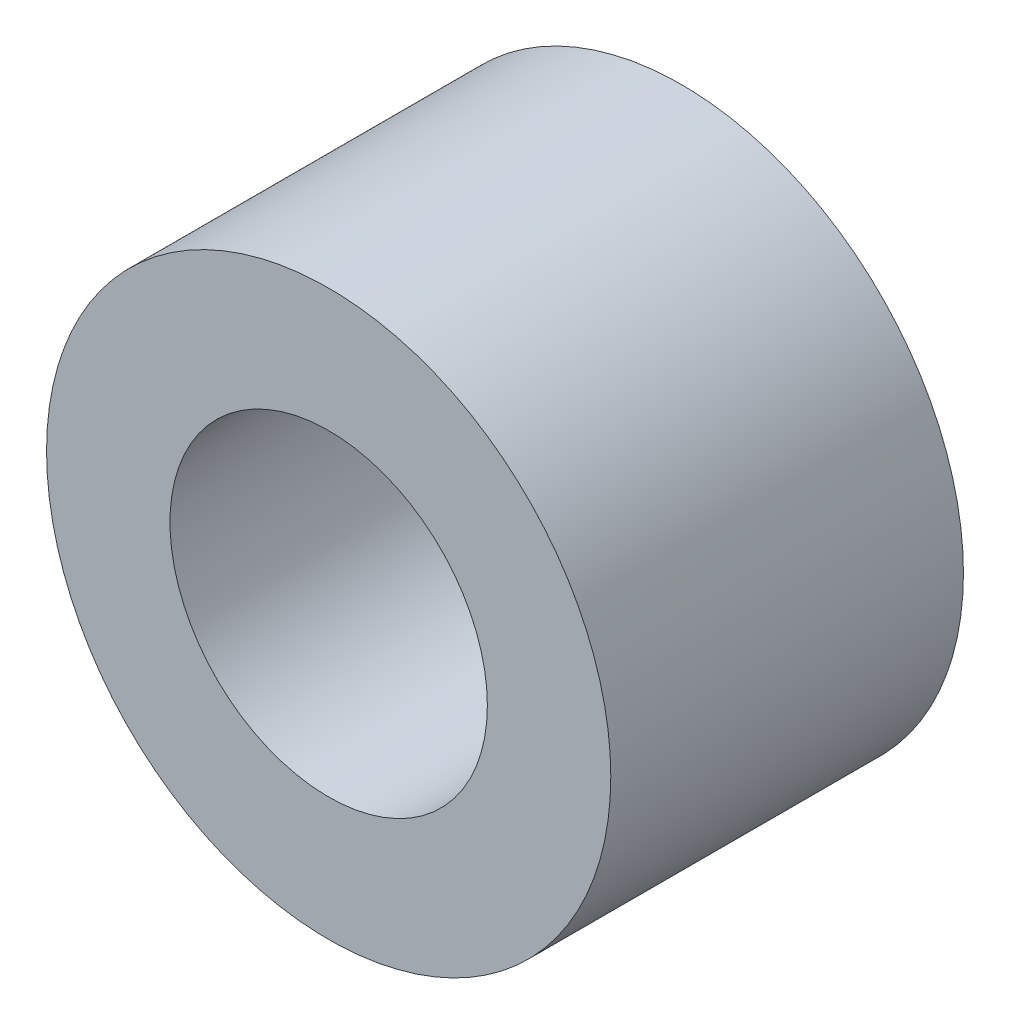
ISO-10303-21;
HEADER;
FILE_DESCRIPTION(('STEP AP214'),'2;1');
FILE_NAME('part.step','',(''),(''),'','','');
FILE_SCHEMA(('AUTOMOTIVE_DESIGN { 1 0 10303 214 1 1 1 1 }'));
ENDSEC;
DATA;
#1=APPLICATION_CONTEXT('core data for automotive mechanical design processes');
#2=APPLICATION_PROTOCOL_DEFINITION('international standard','automotive_design',2000,#1);
#3=PRODUCT_CONTEXT('',#1,'mechanical');
#4=PRODUCT('Part','Part','',(#3));
#5=PRODUCT_RELATED_PRODUCT_CATEGORY('part','',(#4));
#6=PRODUCT_DEFINITION_FORMATION('','',#4);
#7=PRODUCT_DEFINITION_CONTEXT('part definition',#1,'design');
#8=PRODUCT_DEFINITION('design','',#6,#7);
#9=PRODUCT_DEFINITION_SHAPE('','',#8);
#10=(LENGTH_UNIT() NAMED_UNIT(*) SI_UNIT(.MILLI.,.METRE.));
#11=(NAMED_UNIT(*) PLANE_ANGLE_UNIT() SI_UNIT($,.RADIAN.));
#12=(NAMED_UNIT(*) SI_UNIT($,.STERADIAN.) SOLID_ANGLE_UNIT());
#13=UNCERTAINTY_MEASURE_WITH_UNIT(LENGTH_MEASURE(1.E-05),#10,'distance_accuracy_value','');
#14=(GEOMETRIC_REPRESENTATION_CONTEXT(3) GLOBAL_UNCERTAINTY_ASSIGNED_CONTEXT((#13)) GLOBAL_UNIT_ASSIGNED_CONTEXT((#10,
#11,#12)) REPRESENTATION_CONTEXT('',''));
#15=CARTESIAN_POINT('',(0.,0.,0.));
#16=DIRECTION('',(0.,0.,1.));
#17=DIRECTION('',(1.,0.,0.));
#18=AXIS2_PLACEMENT_3D('',#15,#16,#17);
#19=CARTESIAN_POINT('',(0.,0.,5.));
#20=DIRECTION('',(0.,0.,-1.));
#21=DIRECTION('',(-1.,0.,0.));
#22=AXIS2_PLACEMENT_3D('',#19,#20,#21);
#23=CYLINDRICAL_SURFACE('',#22,4.);
#24=CARTESIAN_POINT('',(0.,0.,5.));
#25=DIRECTION('',(0.,0.,1.));
#26=DIRECTION('',(1.,0.,0.));
#27=AXIS2_PLACEMENT_3D('',#24,#25,#26);
#28=CIRCLE('',#27,4.);
#29=CARTESIAN_POINT('',(4.,0.,5.));
#30=VERTEX_POINT('',#29);
#31=EDGE_CURVE('E10',#30,#30,#28,.T.);
#32=ORIENTED_EDGE('',*,*,#31,.F.);
#33=EDGE_LOOP('',(#32));
#34=FACE_BOUND('',#33,.T.);
#35=CARTESIAN_POINT('',(0.,0.,0.));
#36=DIRECTION('',(0.,0.,1.));
#37=DIRECTION('',(1.,0.,0.));
#38=AXIS2_PLACEMENT_3D('',#35,#36,#37);
#39=CIRCLE('',#38,4.);
#40=CARTESIAN_POINT('',(4.,0.,0.));
#41=VERTEX_POINT('',#40);
#42=EDGE_CURVE('E40',#41,#41,#39,.T.);
#43=ORIENTED_EDGE('',*,*,#42,.T.);
#44=EDGE_LOOP('',(#43));
#45=FACE_BOUND('',#44,.T.);
#46=ADVANCED_FACE('F37',(#34,#45),#23,.T.);
#47=CARTESIAN_POINT('',(0.,0.,5.));
#48=DIRECTION('',(0.,0.,1.));
#49=DIRECTION('',(1.,0.,0.));
#50=AXIS2_PLACEMENT_3D('',#47,#48,#49);
#51=PLANE('',#50);
#52=CARTESIAN_POINT('',(0.,0.,5.));
#53=DIRECTION('',(0.,0.,1.));
#54=DIRECTION('',(1.,0.,0.));
#55=AXIS2_PLACEMENT_3D('',#52,#53,#54);
#56=CIRCLE('',#55,2.25);
#57=CARTESIAN_POINT('',(2.25,0.,5.));
#58=VERTEX_POINT('',#57);
#59=EDGE_CURVE('E49',#58,#58,#56,.T.);
#60=ORIENTED_EDGE('',*,*,#59,.F.);
#61=EDGE_LOOP('',(#60));
#62=FACE_BOUND('',#61,.T.);
#63=ORIENTED_EDGE('',*,*,#31,.T.);
#64=EDGE_LOOP('',(#63));
#65=FACE_BOUND('',#64,.T.);
#66=ADVANCED_FACE('F64',(#62,#65),#51,.T.);
#67=CARTESIAN_POINT('',(0.,0.,0.));
#68=DIRECTION('',(0.,0.,1.));
#69=DIRECTION('',(1.,0.,0.));
#70=AXIS2_PLACEMENT_3D('',#67,#68,#69);
#71=PLANE('',#70);
#72=CARTESIAN_POINT('',(0.,0.,0.));
#73=DIRECTION('',(0.,0.,1.));
#74=DIRECTION('',(1.,0.,0.));
#75=AXIS2_PLACEMENT_3D('',#72,#73,#74);
#76=CIRCLE('',#75,2.25);
#77=CARTESIAN_POINT('',(2.25,0.,0.));
#78=VERTEX_POINT('',#77);
#79=EDGE_CURVE('E47',#78,#78,#76,.T.);
#80=ORIENTED_EDGE('',*,*,#79,.T.);
#81=EDGE_LOOP('',(#80));
#82=FACE_BOUND('',#81,.T.);
#83=ORIENTED_EDGE('',*,*,#42,.F.);
#84=EDGE_LOOP('',(#83));
#85=FACE_BOUND('',#84,.T.);
#86=ADVANCED_FACE('F55',(#82,#85),#71,.F.);
#87=CARTESIAN_POINT('',(0.,0.,0.));
#88=DIRECTION('',(0.,0.,1.));
#89=DIRECTION('',(1.,0.,0.));
#90=AXIS2_PLACEMENT_3D('',#87,#88,#89);
#91=CYLINDRICAL_SURFACE('',#90,2.25);
#92=ORIENTED_EDGE('',*,*,#79,.F.);
#93=EDGE_LOOP('',(#92));
#94=FACE_BOUND('',#93,.T.);
#95=ORIENTED_EDGE('',*,*,#59,.T.);
#96=EDGE_LOOP('',(#95));
#97=FACE_BOUND('',#96,.T.);
#98=ADVANCED_FACE('F58',(#94,#97),#91,.F.);
#99=CLOSED_SHELL('',(#46,#66,#86,#98));
#100=MANIFOLD_SOLID_BREP('B2',#99);
#101=ADVANCED_BREP_SHAPE_REPRESENTATION('',(#18,#100),#14);
#102=SHAPE_DEFINITION_REPRESENTATION(#9,#101);
ENDSEC;
END-ISO-10303-21;
